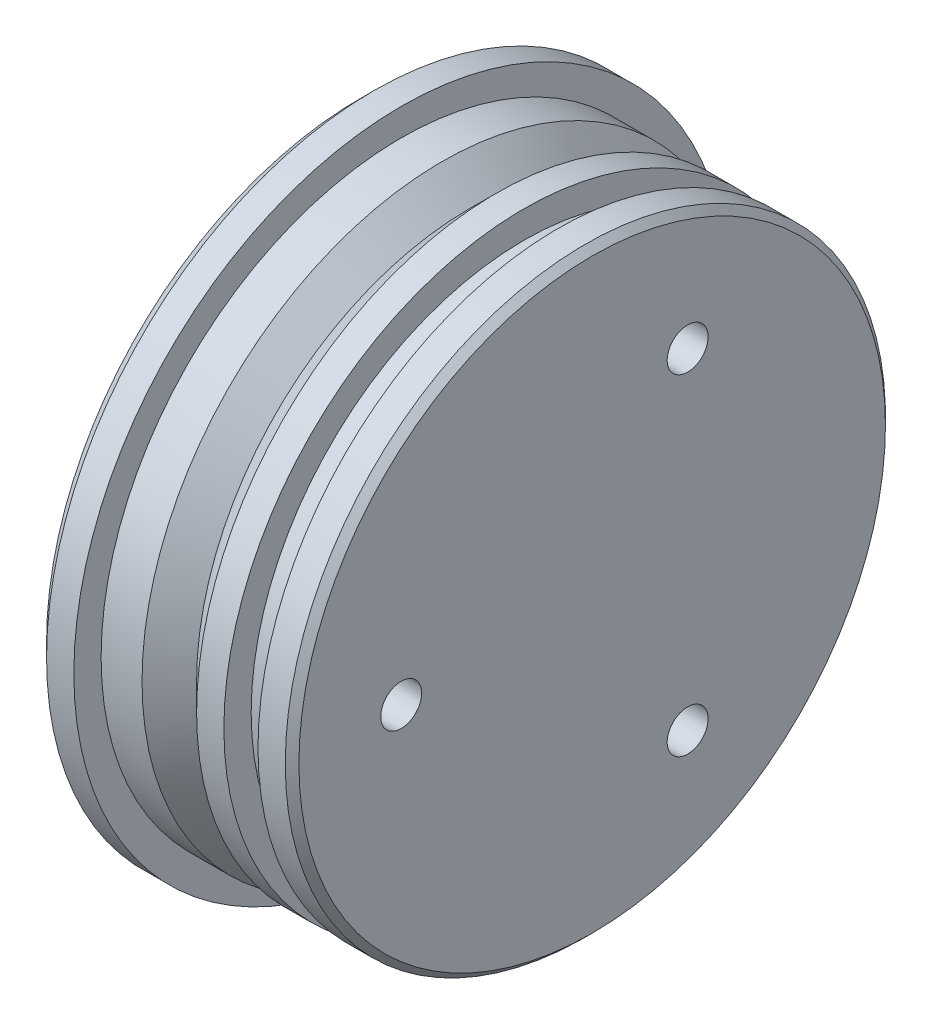
ISO-10303-21;
HEADER;
FILE_DESCRIPTION(('STEP AP214'),'2;1');
FILE_NAME('part.step','',(''),(''),'','','');
FILE_SCHEMA(('AUTOMOTIVE_DESIGN { 1 0 10303 214 1 1 1 1 }'));
ENDSEC;
DATA;
#1=APPLICATION_CONTEXT('core data for automotive mechanical design processes');
#2=APPLICATION_PROTOCOL_DEFINITION('international standard','automotive_design',2000,#1);
#3=PRODUCT_CONTEXT('',#1,'mechanical');
#4=PRODUCT('Part','Part','',(#3));
#5=PRODUCT_RELATED_PRODUCT_CATEGORY('part','',(#4));
#6=PRODUCT_DEFINITION_FORMATION('','',#4);
#7=PRODUCT_DEFINITION_CONTEXT('part definition',#1,'design');
#8=PRODUCT_DEFINITION('design','',#6,#7);
#9=PRODUCT_DEFINITION_SHAPE('','',#8);
#10=(LENGTH_UNIT() NAMED_UNIT(*) SI_UNIT(.MILLI.,.METRE.));
#11=(NAMED_UNIT(*) PLANE_ANGLE_UNIT() SI_UNIT($,.RADIAN.));
#12=(NAMED_UNIT(*) SI_UNIT($,.STERADIAN.) SOLID_ANGLE_UNIT());
#13=UNCERTAINTY_MEASURE_WITH_UNIT(LENGTH_MEASURE(1.E-05),#10,'distance_accuracy_value','');
#14=(GEOMETRIC_REPRESENTATION_CONTEXT(3) GLOBAL_UNCERTAINTY_ASSIGNED_CONTEXT((#13)) GLOBAL_UNIT_ASSIGNED_CONTEXT((#10,
#11,#12)) REPRESENTATION_CONTEXT('',''));
#15=CARTESIAN_POINT('',(0.,0.,0.));
#16=DIRECTION('',(0.,0.,1.));
#17=DIRECTION('',(1.,0.,0.));
#18=AXIS2_PLACEMENT_3D('',#15,#16,#17);
#19=CARTESIAN_POINT('',(-17.,0.,0.));
#20=DIRECTION('',(1.,0.,0.));
#21=DIRECTION('',(0.,0.,-1.));
#22=AXIS2_PLACEMENT_3D('',#19,#20,#21);
#23=PLANE('',#22);
#24=CARTESIAN_POINT('',(-17.,0.,0.));
#25=DIRECTION('',(-1.,0.,0.));
#26=DIRECTION('',(0.,0.,1.));
#27=AXIS2_PLACEMENT_3D('',#24,#25,#26);
#28=CIRCLE('',#27,23.);
#29=CARTESIAN_POINT('',(-17.,0.,23.));
#30=VERTEX_POINT('',#29);
#31=EDGE_CURVE('E10',#30,#30,#28,.T.);
#32=ORIENTED_EDGE('',*,*,#31,.T.);
#33=EDGE_LOOP('',(#32));
#34=FACE_BOUND('',#33,.T.);
#35=ADVANCED_FACE('F35',(#34),#23,.F.);
#36=CARTESIAN_POINT('',(-16.,0.,0.));
#37=DIRECTION('',(1.,0.,0.));
#38=DIRECTION('',(0.,0.,-1.));
#39=AXIS2_PLACEMENT_3D('',#36,#37,#38);
#40=CONICAL_SURFACE('',#39,24.,0.785398163397448);
#41=ORIENTED_EDGE('',*,*,#31,.F.);
#42=EDGE_LOOP('',(#41));
#43=FACE_BOUND('',#42,.T.);
#44=CARTESIAN_POINT('',(-16.,0.,0.));
#45=DIRECTION('',(-1.,0.,0.));
#46=DIRECTION('',(0.,0.,1.));
#47=AXIS2_PLACEMENT_3D('',#44,#45,#46);
#48=CIRCLE('',#47,24.);
#49=CARTESIAN_POINT('',(-16.,0.,24.));
#50=VERTEX_POINT('',#49);
#51=EDGE_CURVE('E41',#50,#50,#48,.T.);
#52=ORIENTED_EDGE('',*,*,#51,.T.);
#53=EDGE_LOOP('',(#52));
#54=FACE_BOUND('',#53,.T.);
#55=ADVANCED_FACE('F133',(#43,#54),#40,.T.);
#56=CARTESIAN_POINT('',(0.,0.,0.));
#57=DIRECTION('',(-1.,0.,0.));
#58=DIRECTION('',(0.,0.,1.));
#59=AXIS2_PLACEMENT_3D('',#56,#57,#58);
#60=CYLINDRICAL_SURFACE('',#59,24.);
#61=ORIENTED_EDGE('',*,*,#51,.F.);
#62=EDGE_LOOP('',(#61));
#63=FACE_BOUND('',#62,.T.);
#64=CARTESIAN_POINT('',(-14.,0.,0.));
#65=DIRECTION('',(-1.,0.,0.));
#66=DIRECTION('',(0.,0.,1.));
#67=AXIS2_PLACEMENT_3D('',#64,#65,#66);
#68=CIRCLE('',#67,24.);
#69=CARTESIAN_POINT('',(-14.,0.,24.));
#70=VERTEX_POINT('',#69);
#71=EDGE_CURVE('E45',#70,#70,#68,.T.);
#72=ORIENTED_EDGE('',*,*,#71,.T.);
#73=EDGE_LOOP('',(#72));
#74=FACE_BOUND('',#73,.T.);
#75=ADVANCED_FACE('F137',(#63,#74),#60,.T.);
#76=CARTESIAN_POINT('',(-14.,24.,0.));
#77=DIRECTION('',(-1.,0.,0.));
#78=DIRECTION('',(0.,0.,1.));
#79=AXIS2_PLACEMENT_3D('',#76,#77,#78);
#80=PLANE('',#79);
#81=ORIENTED_EDGE('',*,*,#71,.F.);
#82=EDGE_LOOP('',(#81));
#83=FACE_BOUND('',#82,.T.);
#84=CARTESIAN_POINT('',(-14.,0.,0.));
#85=DIRECTION('',(-1.,0.,0.));
#86=DIRECTION('',(0.,0.,1.));
#87=AXIS2_PLACEMENT_3D('',#84,#85,#86);
#88=CIRCLE('',#87,22.);
#89=CARTESIAN_POINT('',(-14.,0.,22.));
#90=VERTEX_POINT('',#89);
#91=EDGE_CURVE('E49',#90,#90,#88,.T.);
#92=ORIENTED_EDGE('',*,*,#91,.T.);
#93=EDGE_LOOP('',(#92));
#94=FACE_BOUND('',#93,.T.);
#95=ADVANCED_FACE('F142',(#83,#94),#80,.F.);
#96=CARTESIAN_POINT('',(0.,0.,0.));
#97=DIRECTION('',(-1.,0.,0.));
#98=DIRECTION('',(0.,0.,1.));
#99=AXIS2_PLACEMENT_3D('',#96,#97,#98);
#100=CYLINDRICAL_SURFACE('',#99,22.);
#101=ORIENTED_EDGE('',*,*,#91,.F.);
#102=EDGE_LOOP('',(#101));
#103=FACE_BOUND('',#102,.T.);
#104=CARTESIAN_POINT('',(-11.,0.,0.));
#105=DIRECTION('',(-1.,0.,0.));
#106=DIRECTION('',(0.,0.,1.));
#107=AXIS2_PLACEMENT_3D('',#104,#105,#106);
#108=CIRCLE('',#107,22.);
#109=CARTESIAN_POINT('',(-11.,0.,22.));
#110=VERTEX_POINT('',#109);
#111=EDGE_CURVE('E54',#110,#110,#108,.T.);
#112=ORIENTED_EDGE('',*,*,#111,.T.);
#113=EDGE_LOOP('',(#112));
#114=FACE_BOUND('',#113,.T.);
#115=ADVANCED_FACE('F148',(#103,#114),#100,.T.);
#116=CARTESIAN_POINT('',(-9.00000000000002,0.,0.));
#117=DIRECTION('',(-1.,0.,0.));
#118=DIRECTION('',(0.,0.,1.));
#119=AXIS2_PLACEMENT_3D('',#116,#117,#118);
#120=CONICAL_SURFACE('',#119,20.,0.785398163397451);
#121=ORIENTED_EDGE('',*,*,#111,.F.);
#122=EDGE_LOOP('',(#121));
#123=FACE_BOUND('',#122,.T.);
#124=CARTESIAN_POINT('',(-9.00000000000002,0.,0.));
#125=DIRECTION('',(-1.,0.,0.));
#126=DIRECTION('',(0.,0.,1.));
#127=AXIS2_PLACEMENT_3D('',#124,#125,#126);
#128=CIRCLE('',#127,20.);
#129=CARTESIAN_POINT('',(-9.00000000000002,0.,20.));
#130=VERTEX_POINT('',#129);
#131=EDGE_CURVE('E57',#130,#130,#128,.T.);
#132=ORIENTED_EDGE('',*,*,#131,.T.);
#133=EDGE_LOOP('',(#132));
#134=FACE_BOUND('',#133,.T.);
#135=ADVANCED_FACE('F152',(#123,#134),#120,.T.);
#136=CARTESIAN_POINT('',(-7.,0.,0.));
#137=DIRECTION('',(1.,0.,0.));
#138=DIRECTION('',(0.,0.,-1.));
#139=AXIS2_PLACEMENT_3D('',#136,#137,#138);
#140=CONICAL_SURFACE('',#139,22.,0.785398163397445);
#141=ORIENTED_EDGE('',*,*,#131,.F.);
#142=EDGE_LOOP('',(#141));
#143=FACE_BOUND('',#142,.T.);
#144=CARTESIAN_POINT('',(-7.,0.,0.));
#145=DIRECTION('',(-1.,0.,0.));
#146=DIRECTION('',(0.,0.,1.));
#147=AXIS2_PLACEMENT_3D('',#144,#145,#146);
#148=CIRCLE('',#147,22.);
#149=CARTESIAN_POINT('',(-7.,0.,22.));
#150=VERTEX_POINT('',#149);
#151=EDGE_CURVE('E60',#150,#150,#148,.T.);
#152=ORIENTED_EDGE('',*,*,#151,.T.);
#153=EDGE_LOOP('',(#152));
#154=FACE_BOUND('',#153,.T.);
#155=ADVANCED_FACE('F156',(#143,#154),#140,.T.);
#156=CARTESIAN_POINT('',(0.,0.,0.));
#157=DIRECTION('',(-1.,0.,0.));
#158=DIRECTION('',(0.,0.,1.));
#159=AXIS2_PLACEMENT_3D('',#156,#157,#158);
#160=CYLINDRICAL_SURFACE('',#159,22.);
#161=ORIENTED_EDGE('',*,*,#151,.F.);
#162=EDGE_LOOP('',(#161));
#163=FACE_BOUND('',#162,.T.);
#164=CARTESIAN_POINT('',(-5.00000000000001,0.,0.));
#165=DIRECTION('',(-1.,0.,0.));
#166=DIRECTION('',(0.,0.,1.));
#167=AXIS2_PLACEMENT_3D('',#164,#165,#166);
#168=CIRCLE('',#167,22.);
#169=CARTESIAN_POINT('',(-5.00000000000001,0.,22.));
#170=VERTEX_POINT('',#169);
#171=EDGE_CURVE('E63',#170,#170,#168,.T.);
#172=ORIENTED_EDGE('',*,*,#171,.T.);
#173=EDGE_LOOP('',(#172));
#174=FACE_BOUND('',#173,.T.);
#175=ADVANCED_FACE('F160',(#163,#174),#160,.T.);
#176=CARTESIAN_POINT('',(-5.,22.,0.));
#177=DIRECTION('',(-1.,0.,0.));
#178=DIRECTION('',(0.,0.,1.));
#179=AXIS2_PLACEMENT_3D('',#176,#177,#178);
#180=PLANE('',#179);
#181=ORIENTED_EDGE('',*,*,#171,.F.);
#182=EDGE_LOOP('',(#181));
#183=FACE_BOUND('',#182,.T.);
#184=CARTESIAN_POINT('',(-5.,0.,0.));
#185=DIRECTION('',(-1.,0.,0.));
#186=DIRECTION('',(0.,0.,1.));
#187=AXIS2_PLACEMENT_3D('',#184,#185,#186);
#188=CIRCLE('',#187,20.);
#189=CARTESIAN_POINT('',(-5.,0.,20.));
#190=VERTEX_POINT('',#189);
#191=EDGE_CURVE('E66',#190,#190,#188,.T.);
#192=ORIENTED_EDGE('',*,*,#191,.T.);
#193=EDGE_LOOP('',(#192));
#194=FACE_BOUND('',#193,.T.);
#195=ADVANCED_FACE('F164',(#183,#194),#180,.F.);
#196=CARTESIAN_POINT('',(0.,0.,0.));
#197=DIRECTION('',(-1.,0.,0.));
#198=DIRECTION('',(0.,0.,1.));
#199=AXIS2_PLACEMENT_3D('',#196,#197,#198);
#200=CYLINDRICAL_SURFACE('',#199,20.);
#201=ORIENTED_EDGE('',*,*,#191,.F.);
#202=EDGE_LOOP('',(#201));
#203=FACE_BOUND('',#202,.T.);
#204=CARTESIAN_POINT('',(-2.5,0.,0.));
#205=DIRECTION('',(-1.,0.,0.));
#206=DIRECTION('',(0.,0.,1.));
#207=AXIS2_PLACEMENT_3D('',#204,#205,#206);
#208=CIRCLE('',#207,20.);
#209=CARTESIAN_POINT('',(-2.5,0.,20.));
#210=VERTEX_POINT('',#209);
#211=EDGE_CURVE('E69',#210,#210,#208,.T.);
#212=ORIENTED_EDGE('',*,*,#211,.T.);
#213=EDGE_LOOP('',(#212));
#214=FACE_BOUND('',#213,.T.);
#215=ADVANCED_FACE('F168',(#203,#214),#200,.T.);
#216=CARTESIAN_POINT('',(-2.5,20.,0.));
#217=DIRECTION('',(1.,0.,0.));
#218=DIRECTION('',(0.,0.,-1.));
#219=AXIS2_PLACEMENT_3D('',#216,#217,#218);
#220=PLANE('',#219);
#221=ORIENTED_EDGE('',*,*,#211,.F.);
#222=EDGE_LOOP('',(#221));
#223=FACE_BOUND('',#222,.T.);
#224=CARTESIAN_POINT('',(-2.5,0.,0.));
#225=DIRECTION('',(-1.,0.,0.));
#226=DIRECTION('',(0.,0.,1.));
#227=AXIS2_PLACEMENT_3D('',#224,#225,#226);
#228=CIRCLE('',#227,22.);
#229=CARTESIAN_POINT('',(-2.5,0.,22.));
#230=VERTEX_POINT('',#229);
#231=EDGE_CURVE('E72',#230,#230,#228,.T.);
#232=ORIENTED_EDGE('',*,*,#231,.T.);
#233=EDGE_LOOP('',(#232));
#234=FACE_BOUND('',#233,.T.);
#235=ADVANCED_FACE('F128',(#223,#234),#220,.F.);
#236=CARTESIAN_POINT('',(0.,0.,0.));
#237=DIRECTION('',(-1.,0.,0.));
#238=DIRECTION('',(0.,0.,1.));
#239=AXIS2_PLACEMENT_3D('',#236,#237,#238);
#240=CYLINDRICAL_SURFACE('',#239,22.);
#241=ORIENTED_EDGE('',*,*,#231,.F.);
#242=EDGE_LOOP('',(#241));
#243=FACE_BOUND('',#242,.T.);
#244=CARTESIAN_POINT('',(-0.500000000000002,0.,0.));
#245=DIRECTION('',(-1.,0.,0.));
#246=DIRECTION('',(0.,0.,1.));
#247=AXIS2_PLACEMENT_3D('',#244,#245,#246);
#248=CIRCLE('',#247,22.);
#249=CARTESIAN_POINT('',(-0.500000000000002,0.,22.));
#250=VERTEX_POINT('',#249);
#251=EDGE_CURVE('E75',#250,#250,#248,.T.);
#252=ORIENTED_EDGE('',*,*,#251,.T.);
#253=EDGE_LOOP('',(#252));
#254=FACE_BOUND('',#253,.T.);
#255=ADVANCED_FACE('F122',(#243,#254),#240,.T.);
#256=CARTESIAN_POINT('',(0.,0.,0.));
#257=DIRECTION('',(-1.,0.,0.));
#258=DIRECTION('',(0.,0.,1.));
#259=AXIS2_PLACEMENT_3D('',#256,#257,#258);
#260=CONICAL_SURFACE('',#259,21.5,0.785398163397446);
#261=ORIENTED_EDGE('',*,*,#251,.F.);
#262=EDGE_LOOP('',(#261));
#263=FACE_BOUND('',#262,.T.);
#264=CARTESIAN_POINT('',(0.,0.,0.));
#265=DIRECTION('',(-1.,0.,0.));
#266=DIRECTION('',(0.,0.,1.));
#267=AXIS2_PLACEMENT_3D('',#264,#265,#266);
#268=CIRCLE('',#267,21.5);
#269=CARTESIAN_POINT('',(0.,0.,21.5));
#270=VERTEX_POINT('',#269);
#271=EDGE_CURVE('E78',#270,#270,#268,.T.);
#272=ORIENTED_EDGE('',*,*,#271,.T.);
#273=EDGE_LOOP('',(#272));
#274=FACE_BOUND('',#273,.T.);
#275=ADVANCED_FACE('F113',(#263,#274),#260,.T.);
#276=CARTESIAN_POINT('',(0.,21.5,0.));
#277=DIRECTION('',(-1.,0.,0.));
#278=DIRECTION('',(0.,0.,1.));
#279=AXIS2_PLACEMENT_3D('',#276,#277,#278);
#280=PLANE('',#279);
#281=CARTESIAN_POINT('',(0.,12.1243556529821,-7.));
#282=DIRECTION('',(1.,0.,0.));
#283=DIRECTION('',(0.,0.,-1.));
#284=AXIS2_PLACEMENT_3D('',#281,#282,#283);
#285=CIRCLE('',#284,1.5);
#286=CARTESIAN_POINT('',(0.,12.1243556529821,-8.49999999999999));
#287=VERTEX_POINT('',#286);
#288=EDGE_CURVE('E94',#287,#287,#285,.T.);
#289=ORIENTED_EDGE('',*,*,#288,.F.);
#290=EDGE_LOOP('',(#289));
#291=FACE_BOUND('',#290,.T.);
#292=CARTESIAN_POINT('',(0.,-12.1243556529821,-7.00000000000001));
#293=DIRECTION('',(1.,0.,0.));
#294=DIRECTION('',(0.,0.,-1.));
#295=AXIS2_PLACEMENT_3D('',#292,#293,#294);
#296=CIRCLE('',#295,1.5);
#297=CARTESIAN_POINT('',(0.,-12.1243556529821,-8.50000000000001));
#298=VERTEX_POINT('',#297);
#299=EDGE_CURVE('E91',#298,#298,#296,.T.);
#300=ORIENTED_EDGE('',*,*,#299,.F.);
#301=EDGE_LOOP('',(#300));
#302=FACE_BOUND('',#301,.T.);
#303=CARTESIAN_POINT('',(0.,0.,14.));
#304=DIRECTION('',(1.,0.,0.));
#305=DIRECTION('',(0.,0.,-1.));
#306=AXIS2_PLACEMENT_3D('',#303,#304,#305);
#307=CIRCLE('',#306,1.5);
#308=CARTESIAN_POINT('',(0.,0.,12.5));
#309=VERTEX_POINT('',#308);
#310=EDGE_CURVE('E85',#309,#309,#307,.T.);
#311=ORIENTED_EDGE('',*,*,#310,.F.);
#312=EDGE_LOOP('',(#311));
#313=FACE_BOUND('',#312,.T.);
#314=ORIENTED_EDGE('',*,*,#271,.F.);
#315=EDGE_LOOP('',(#314));
#316=FACE_BOUND('',#315,.T.);
#317=ADVANCED_FACE('F109',(#291,#302,#313,#316),#280,.F.);
#318=CARTESIAN_POINT('',(-10.,0.,14.));
#319=DIRECTION('',(1.,0.,0.));
#320=DIRECTION('',(0.,0.,-1.));
#321=AXIS2_PLACEMENT_3D('',#318,#319,#320);
#322=CYLINDRICAL_SURFACE('',#321,1.5);
#323=CARTESIAN_POINT('',(-10.,0.,14.));
#324=DIRECTION('',(1.,0.,0.));
#325=DIRECTION('',(0.,0.,-1.));
#326=AXIS2_PLACEMENT_3D('',#323,#324,#325);
#327=CIRCLE('',#326,1.5);
#328=CARTESIAN_POINT('',(-10.,0.,12.5));
#329=VERTEX_POINT('',#328);
#330=EDGE_CURVE('E82',#329,#329,#327,.T.);
#331=ORIENTED_EDGE('',*,*,#330,.F.);
#332=EDGE_LOOP('',(#331));
#333=FACE_BOUND('',#332,.T.);
#334=ORIENTED_EDGE('',*,*,#310,.T.);
#335=EDGE_LOOP('',(#334));
#336=FACE_BOUND('',#335,.T.);
#337=ADVANCED_FACE('F112',(#333,#336),#322,.F.);
#338=CARTESIAN_POINT('',(-10.,0.,14.));
#339=DIRECTION('',(1.,0.,0.));
#340=DIRECTION('',(0.,0.,-1.));
#341=AXIS2_PLACEMENT_3D('',#338,#339,#340);
#342=PLANE('',#341);
#343=ORIENTED_EDGE('',*,*,#330,.T.);
#344=EDGE_LOOP('',(#343));
#345=FACE_BOUND('',#344,.T.);
#346=ADVANCED_FACE('F207',(#345),#342,.T.);
#347=CARTESIAN_POINT('',(-10.,-12.1243556529821,-7.00000000000001));
#348=DIRECTION('',(1.,0.,0.));
#349=DIRECTION('',(0.,0.,-1.));
#350=AXIS2_PLACEMENT_3D('',#347,#348,#349);
#351=CYLINDRICAL_SURFACE('',#350,1.5);
#352=CARTESIAN_POINT('',(-10.,-12.1243556529821,-7.00000000000001));
#353=DIRECTION('',(1.,0.,0.));
#354=DIRECTION('',(0.,0.,-1.));
#355=AXIS2_PLACEMENT_3D('',#352,#353,#354);
#356=CIRCLE('',#355,1.5);
#357=CARTESIAN_POINT('',(-10.,-12.1243556529821,-8.50000000000001));
#358=VERTEX_POINT('',#357);
#359=EDGE_CURVE('E88',#358,#358,#356,.T.);
#360=ORIENTED_EDGE('',*,*,#359,.F.);
#361=EDGE_LOOP('',(#360));
#362=FACE_BOUND('',#361,.T.);
#363=ORIENTED_EDGE('',*,*,#299,.T.);
#364=EDGE_LOOP('',(#363));
#365=FACE_BOUND('',#364,.T.);
#366=ADVANCED_FACE('F217',(#362,#365),#351,.F.);
#367=CARTESIAN_POINT('',(-10.,0.,0.));
#368=DIRECTION('',(1.,0.,0.));
#369=DIRECTION('',(0.,0.,-1.));
#370=AXIS2_PLACEMENT_3D('',#367,#368,#369);
#371=PLANE('',#370);
#372=ORIENTED_EDGE('',*,*,#359,.T.);
#373=EDGE_LOOP('',(#372));
#374=FACE_BOUND('',#373,.T.);
#375=ADVANCED_FACE('F105',(#374),#371,.T.);
#376=CARTESIAN_POINT('',(-10.,12.1243556529821,-7.));
#377=DIRECTION('',(1.,0.,0.));
#378=DIRECTION('',(0.,0.,-1.));
#379=AXIS2_PLACEMENT_3D('',#376,#377,#378);
#380=CYLINDRICAL_SURFACE('',#379,1.5);
#381=CARTESIAN_POINT('',(-10.,12.1243556529821,-7.));
#382=DIRECTION('',(1.,0.,0.));
#383=DIRECTION('',(0.,0.,-1.));
#384=AXIS2_PLACEMENT_3D('',#381,#382,#383);
#385=CIRCLE('',#384,1.5);
#386=CARTESIAN_POINT('',(-10.,12.1243556529821,-8.49999999999999));
#387=VERTEX_POINT('',#386);
#388=EDGE_CURVE('E81',#387,#387,#385,.T.);
#389=ORIENTED_EDGE('',*,*,#388,.F.);
#390=EDGE_LOOP('',(#389));
#391=FACE_BOUND('',#390,.T.);
#392=ORIENTED_EDGE('',*,*,#288,.T.);
#393=EDGE_LOOP('',(#392));
#394=FACE_BOUND('',#393,.T.);
#395=ADVANCED_FACE('F102',(#391,#394),#380,.F.);
#396=CARTESIAN_POINT('',(-10.,0.,0.));
#397=DIRECTION('',(1.,0.,0.));
#398=DIRECTION('',(0.,0.,-1.));
#399=AXIS2_PLACEMENT_3D('',#396,#397,#398);
#400=PLANE('',#399);
#401=ORIENTED_EDGE('',*,*,#388,.T.);
#402=EDGE_LOOP('',(#401));
#403=FACE_BOUND('',#402,.T.);
#404=ADVANCED_FACE('F100',(#403),#400,.T.);
#405=CLOSED_SHELL('',(#35,#55,#75,#95,#115,#135,#155,#175,#195,#215,#235,#255,#275,#317,#337,
#346,#366,#375,#395,#404));
#406=MANIFOLD_SOLID_BREP('B2',#405);
#407=ADVANCED_BREP_SHAPE_REPRESENTATION('',(#18,#406),#14);
#408=SHAPE_DEFINITION_REPRESENTATION(#9,#407);
ENDSEC;
END-ISO-10303-21;
